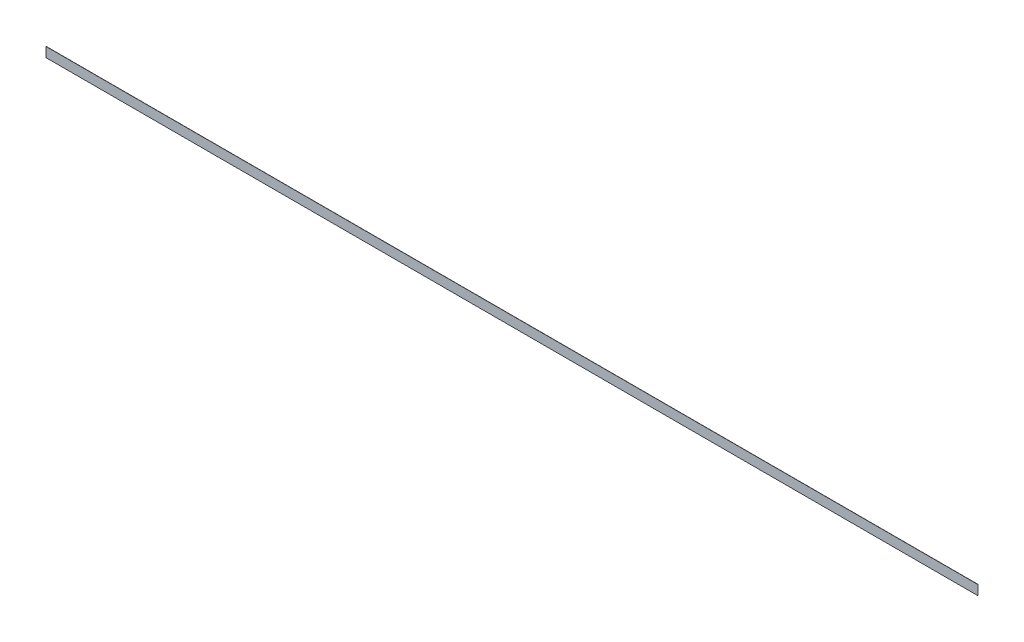
ISO-10303-21;
HEADER;
FILE_DESCRIPTION(('STEP AP214'),'2;1');
FILE_NAME('part.step','',(''),(''),'','','');
FILE_SCHEMA(('AUTOMOTIVE_DESIGN { 1 0 10303 214 1 1 1 1 }'));
ENDSEC;
DATA;
#1=APPLICATION_CONTEXT('core data for automotive mechanical design processes');
#2=APPLICATION_PROTOCOL_DEFINITION('international standard','automotive_design',2000,#1);
#3=PRODUCT_CONTEXT('',#1,'mechanical');
#4=PRODUCT('Part','Part','',(#3));
#5=PRODUCT_RELATED_PRODUCT_CATEGORY('part','',(#4));
#6=PRODUCT_DEFINITION_FORMATION('','',#4);
#7=PRODUCT_DEFINITION_CONTEXT('part definition',#1,'design');
#8=PRODUCT_DEFINITION('design','',#6,#7);
#9=PRODUCT_DEFINITION_SHAPE('','',#8);
#10=(LENGTH_UNIT() NAMED_UNIT(*) SI_UNIT(.MILLI.,.METRE.));
#11=(NAMED_UNIT(*) PLANE_ANGLE_UNIT() SI_UNIT($,.RADIAN.));
#12=(NAMED_UNIT(*) SI_UNIT($,.STERADIAN.) SOLID_ANGLE_UNIT());
#13=UNCERTAINTY_MEASURE_WITH_UNIT(LENGTH_MEASURE(1.E-05),#10,'distance_accuracy_value','');
#14=(GEOMETRIC_REPRESENTATION_CONTEXT(3) GLOBAL_UNCERTAINTY_ASSIGNED_CONTEXT((#13)) GLOBAL_UNIT_ASSIGNED_CONTEXT((#10,
#11,#12)) REPRESENTATION_CONTEXT('',''));
#15=CARTESIAN_POINT('',(0.,0.,0.));
#16=DIRECTION('',(0.,0.,1.));
#17=DIRECTION('',(1.,0.,0.));
#18=AXIS2_PLACEMENT_3D('',#15,#16,#17);
#19=CARTESIAN_POINT('',(0.,0.,0.1));
#20=DIRECTION('',(1.,0.,0.));
#21=DIRECTION('',(0.,0.,-1.));
#22=AXIS2_PLACEMENT_3D('',#19,#20,#21);
#23=PLANE('',#22);
#24=DIRECTION('',(0.,-1.,0.));
#25=VECTOR('',#24,1.);
#26=CARTESIAN_POINT('',(0.,0.,0.));
#27=LINE('',#26,#25);
#28=CARTESIAN_POINT('',(0.,0.,0.));
#29=VERTEX_POINT('',#28);
#30=CARTESIAN_POINT('',(0.,-5.,0.));
#31=VERTEX_POINT('',#30);
#32=EDGE_CURVE('E95',#29,#31,#27,.T.);
#33=ORIENTED_EDGE('',*,*,#32,.T.);
#34=DIRECTION('',(0.,0.,-1.));
#35=VECTOR('',#34,1.);
#36=CARTESIAN_POINT('',(0.,-5.,0.1));
#37=LINE('',#36,#35);
#38=CARTESIAN_POINT('',(0.,-5.,0.1));
#39=VERTEX_POINT('',#38);
#40=EDGE_CURVE('E11',#39,#31,#37,.T.);
#41=ORIENTED_EDGE('',*,*,#40,.F.);
#42=DIRECTION('',(0.,-1.,0.));
#43=VECTOR('',#42,1.);
#44=CARTESIAN_POINT('',(0.,0.,0.1));
#45=LINE('',#44,#43);
#46=CARTESIAN_POINT('',(0.,0.,0.1));
#47=VERTEX_POINT('',#46);
#48=EDGE_CURVE('E83',#47,#39,#45,.T.);
#49=ORIENTED_EDGE('',*,*,#48,.F.);
#50=DIRECTION('',(0.,0.,-1.));
#51=VECTOR('',#50,1.);
#52=CARTESIAN_POINT('',(0.,0.,0.1));
#53=LINE('',#52,#51);
#54=EDGE_CURVE('E91',#47,#29,#53,.T.);
#55=ORIENTED_EDGE('',*,*,#54,.T.);
#56=EDGE_LOOP('',(#33,#41,#49,#55));
#57=FACE_BOUND('',#56,.T.);
#58=ADVANCED_FACE('F32',(#57),#23,.F.);
#59=CARTESIAN_POINT('',(0.,-5.,0.1));
#60=DIRECTION('',(0.,1.,0.));
#61=DIRECTION('',(0.,0.,1.));
#62=AXIS2_PLACEMENT_3D('',#59,#60,#61);
#63=PLANE('',#62);
#64=DIRECTION('',(1.,0.,0.));
#65=VECTOR('',#64,1.);
#66=CARTESIAN_POINT('',(0.,-5.,0.));
#67=LINE('',#66,#65);
#68=CARTESIAN_POINT('',(480.,-5.,0.));
#69=VERTEX_POINT('',#68);
#70=EDGE_CURVE('E87',#31,#69,#67,.T.);
#71=ORIENTED_EDGE('',*,*,#70,.T.);
#72=DIRECTION('',(0.,0.,-1.));
#73=VECTOR('',#72,1.);
#74=CARTESIAN_POINT('',(480.,-5.,0.1));
#75=LINE('',#74,#73);
#76=CARTESIAN_POINT('',(480.,-5.,0.1));
#77=VERTEX_POINT('',#76);
#78=EDGE_CURVE('E40',#77,#69,#75,.T.);
#79=ORIENTED_EDGE('',*,*,#78,.F.);
#80=DIRECTION('',(1.,0.,0.));
#81=VECTOR('',#80,1.);
#82=CARTESIAN_POINT('',(0.,-5.,0.1));
#83=LINE('',#82,#81);
#84=EDGE_CURVE('E78',#39,#77,#83,.T.);
#85=ORIENTED_EDGE('',*,*,#84,.F.);
#86=ORIENTED_EDGE('',*,*,#40,.T.);
#87=EDGE_LOOP('',(#71,#79,#85,#86));
#88=FACE_BOUND('',#87,.T.);
#89=ADVANCED_FACE('F86',(#88),#63,.F.);
#90=CARTESIAN_POINT('',(480.,0.,0.1));
#91=DIRECTION('',(-1.,0.,0.));
#92=DIRECTION('',(0.,0.,1.));
#93=AXIS2_PLACEMENT_3D('',#90,#91,#92);
#94=PLANE('',#93);
#95=DIRECTION('',(0.,1.,0.));
#96=VECTOR('',#95,1.);
#97=CARTESIAN_POINT('',(480.,0.,0.));
#98=LINE('',#97,#96);
#99=CARTESIAN_POINT('',(480.,0.,0.));
#100=VERTEX_POINT('',#99);
#101=EDGE_CURVE('E65',#69,#100,#98,.T.);
#102=ORIENTED_EDGE('',*,*,#101,.T.);
#103=DIRECTION('',(0.,0.,-1.));
#104=VECTOR('',#103,1.);
#105=CARTESIAN_POINT('',(480.,0.,0.1));
#106=LINE('',#105,#104);
#107=CARTESIAN_POINT('',(480.,0.,0.1));
#108=VERTEX_POINT('',#107);
#109=EDGE_CURVE('E88',#108,#100,#106,.T.);
#110=ORIENTED_EDGE('',*,*,#109,.F.);
#111=DIRECTION('',(0.,1.,0.));
#112=VECTOR('',#111,1.);
#113=CARTESIAN_POINT('',(480.,0.,0.1));
#114=LINE('',#113,#112);
#115=EDGE_CURVE('E81',#77,#108,#114,.T.);
#116=ORIENTED_EDGE('',*,*,#115,.F.);
#117=ORIENTED_EDGE('',*,*,#78,.T.);
#118=EDGE_LOOP('',(#102,#110,#116,#117));
#119=FACE_BOUND('',#118,.T.);
#120=ADVANCED_FACE('F89',(#119),#94,.F.);
#121=CARTESIAN_POINT('',(0.,0.,0.1));
#122=DIRECTION('',(0.,-1.,0.));
#123=DIRECTION('',(0.,0.,-1.));
#124=AXIS2_PLACEMENT_3D('',#121,#122,#123);
#125=PLANE('',#124);
#126=DIRECTION('',(-1.,0.,0.));
#127=VECTOR('',#126,1.);
#128=CARTESIAN_POINT('',(0.,0.,0.));
#129=LINE('',#128,#127);
#130=EDGE_CURVE('E71',#100,#29,#129,.T.);
#131=ORIENTED_EDGE('',*,*,#130,.T.);
#132=ORIENTED_EDGE('',*,*,#54,.F.);
#133=DIRECTION('',(-1.,0.,0.));
#134=VECTOR('',#133,1.);
#135=CARTESIAN_POINT('',(0.,0.,0.1));
#136=LINE('',#135,#134);
#137=EDGE_CURVE('E48',#108,#47,#136,.T.);
#138=ORIENTED_EDGE('',*,*,#137,.F.);
#139=ORIENTED_EDGE('',*,*,#109,.T.);
#140=EDGE_LOOP('',(#131,#132,#138,#139));
#141=FACE_BOUND('',#140,.T.);
#142=ADVANCED_FACE('F102',(#141),#125,.F.);
#143=CARTESIAN_POINT('',(0.,0.,0.1));
#144=DIRECTION('',(0.,0.,1.));
#145=DIRECTION('',(1.,0.,0.));
#146=AXIS2_PLACEMENT_3D('',#143,#144,#145);
#147=PLANE('',#146);
#148=ORIENTED_EDGE('',*,*,#48,.T.);
#149=ORIENTED_EDGE('',*,*,#84,.T.);
#150=ORIENTED_EDGE('',*,*,#115,.T.);
#151=ORIENTED_EDGE('',*,*,#137,.T.);
#152=EDGE_LOOP('',(#148,#149,#150,#151));
#153=FACE_BOUND('',#152,.T.);
#154=ADVANCED_FACE('F79',(#153),#147,.T.);
#155=CARTESIAN_POINT('',(0.,0.,0.));
#156=DIRECTION('',(0.,0.,1.));
#157=DIRECTION('',(1.,0.,0.));
#158=AXIS2_PLACEMENT_3D('',#155,#156,#157);
#159=PLANE('',#158);
#160=ORIENTED_EDGE('',*,*,#32,.F.);
#161=ORIENTED_EDGE('',*,*,#130,.F.);
#162=ORIENTED_EDGE('',*,*,#101,.F.);
#163=ORIENTED_EDGE('',*,*,#70,.F.);
#164=EDGE_LOOP('',(#160,#161,#162,#163));
#165=FACE_BOUND('',#164,.T.);
#166=ADVANCED_FACE('F105',(#165),#159,.F.);
#167=CLOSED_SHELL('',(#58,#89,#120,#142,#154,#166));
#168=MANIFOLD_SOLID_BREP('B2',#167);
#169=ADVANCED_BREP_SHAPE_REPRESENTATION('',(#18,#168),#14);
#170=SHAPE_DEFINITION_REPRESENTATION(#9,#169);
ENDSEC;
END-ISO-10303-21;
